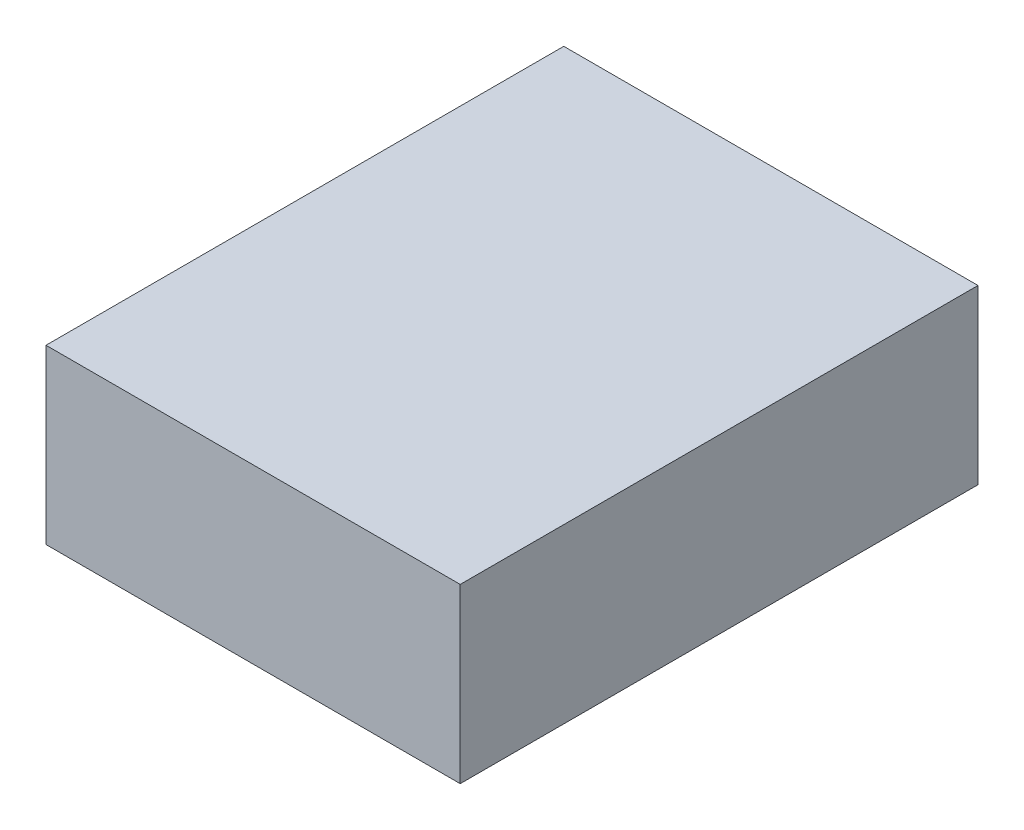
ISO-10303-21;
HEADER;
FILE_DESCRIPTION(('STEP AP214'),'2;1');
FILE_NAME('part.step','',(''),(''),'','','');
FILE_SCHEMA(('AUTOMOTIVE_DESIGN { 1 0 10303 214 1 1 1 1 }'));
ENDSEC;
DATA;
#1=APPLICATION_CONTEXT('core data for automotive mechanical design processes');
#2=APPLICATION_PROTOCOL_DEFINITION('international standard','automotive_design',2000,#1);
#3=PRODUCT_CONTEXT('',#1,'mechanical');
#4=PRODUCT('Part','Part','',(#3));
#5=PRODUCT_RELATED_PRODUCT_CATEGORY('part','',(#4));
#6=PRODUCT_DEFINITION_FORMATION('','',#4);
#7=PRODUCT_DEFINITION_CONTEXT('part definition',#1,'design');
#8=PRODUCT_DEFINITION('design','',#6,#7);
#9=PRODUCT_DEFINITION_SHAPE('','',#8);
#10=(LENGTH_UNIT() NAMED_UNIT(*) SI_UNIT(.MILLI.,.METRE.));
#11=(NAMED_UNIT(*) PLANE_ANGLE_UNIT() SI_UNIT($,.RADIAN.));
#12=(NAMED_UNIT(*) SI_UNIT($,.STERADIAN.) SOLID_ANGLE_UNIT());
#13=UNCERTAINTY_MEASURE_WITH_UNIT(LENGTH_MEASURE(1.E-05),#10,'distance_accuracy_value','');
#14=(GEOMETRIC_REPRESENTATION_CONTEXT(3) GLOBAL_UNCERTAINTY_ASSIGNED_CONTEXT((#13)) GLOBAL_UNIT_ASSIGNED_CONTEXT((#10,
#11,#12)) REPRESENTATION_CONTEXT('',''));
#15=CARTESIAN_POINT('',(0.,0.,0.));
#16=DIRECTION('',(0.,0.,1.));
#17=DIRECTION('',(1.,0.,0.));
#18=AXIS2_PLACEMENT_3D('',#15,#16,#17);
#19=CARTESIAN_POINT('',(0.,127.,0.));
#20=DIRECTION('',(1.,0.,0.));
#21=DIRECTION('',(0.,0.,-1.));
#22=AXIS2_PLACEMENT_3D('',#19,#20,#21);
#23=PLANE('',#22);
#24=DIRECTION('',(0.,0.,1.));
#25=VECTOR('',#24,1.);
#26=CARTESIAN_POINT('',(0.,0.,0.));
#27=LINE('',#26,#25);
#28=CARTESIAN_POINT('',(0.,0.,0.));
#29=VERTEX_POINT('',#28);
#30=CARTESIAN_POINT('',(0.,0.,381.));
#31=VERTEX_POINT('',#30);
#32=EDGE_CURVE('E113',#29,#31,#27,.T.);
#33=ORIENTED_EDGE('',*,*,#32,.T.);
#34=DIRECTION('',(0.,-1.,0.));
#35=VECTOR('',#34,1.);
#36=CARTESIAN_POINT('',(0.,127.,381.));
#37=LINE('',#36,#35);
#38=CARTESIAN_POINT('',(0.,127.,381.));
#39=VERTEX_POINT('',#38);
#40=EDGE_CURVE('E11',#39,#31,#37,.T.);
#41=ORIENTED_EDGE('',*,*,#40,.F.);
#42=DIRECTION('',(0.,0.,1.));
#43=VECTOR('',#42,1.);
#44=CARTESIAN_POINT('',(0.,127.,0.));
#45=LINE('',#44,#43);
#46=CARTESIAN_POINT('',(0.,127.,0.));
#47=VERTEX_POINT('',#46);
#48=EDGE_CURVE('E97',#47,#39,#45,.T.);
#49=ORIENTED_EDGE('',*,*,#48,.F.);
#50=DIRECTION('',(0.,-1.,0.));
#51=VECTOR('',#50,1.);
#52=CARTESIAN_POINT('',(0.,127.,0.));
#53=LINE('',#52,#51);
#54=EDGE_CURVE('E109',#47,#29,#53,.T.);
#55=ORIENTED_EDGE('',*,*,#54,.T.);
#56=EDGE_LOOP('',(#33,#41,#49,#55));
#57=FACE_BOUND('',#56,.T.);
#58=ADVANCED_FACE('F45',(#57),#23,.F.);
#59=CARTESIAN_POINT('',(0.,127.,381.));
#60=DIRECTION('',(0.,0.,-1.));
#61=DIRECTION('',(-1.,0.,0.));
#62=AXIS2_PLACEMENT_3D('',#59,#60,#61);
#63=PLANE('',#62);
#64=DIRECTION('',(1.,0.,0.));
#65=VECTOR('',#64,1.);
#66=CARTESIAN_POINT('',(0.,0.,381.));
#67=LINE('',#66,#65);
#68=CARTESIAN_POINT('',(304.8,0.,381.));
#69=VERTEX_POINT('',#68);
#70=EDGE_CURVE('E102',#31,#69,#67,.T.);
#71=ORIENTED_EDGE('',*,*,#70,.T.);
#72=DIRECTION('',(0.,-1.,0.));
#73=VECTOR('',#72,1.);
#74=CARTESIAN_POINT('',(304.8,127.,381.));
#75=LINE('',#74,#73);
#76=CARTESIAN_POINT('',(304.8,127.,381.));
#77=VERTEX_POINT('',#76);
#78=EDGE_CURVE('E54',#77,#69,#75,.T.);
#79=ORIENTED_EDGE('',*,*,#78,.F.);
#80=DIRECTION('',(1.,0.,0.));
#81=VECTOR('',#80,1.);
#82=CARTESIAN_POINT('',(0.,127.,381.));
#83=LINE('',#82,#81);
#84=EDGE_CURVE('E92',#39,#77,#83,.T.);
#85=ORIENTED_EDGE('',*,*,#84,.F.);
#86=ORIENTED_EDGE('',*,*,#40,.T.);
#87=EDGE_LOOP('',(#71,#79,#85,#86));
#88=FACE_BOUND('',#87,.T.);
#89=ADVANCED_FACE('F101',(#88),#63,.F.);
#90=CARTESIAN_POINT('',(304.8,127.,0.));
#91=DIRECTION('',(-1.,0.,0.));
#92=DIRECTION('',(0.,0.,1.));
#93=AXIS2_PLACEMENT_3D('',#90,#91,#92);
#94=PLANE('',#93);
#95=DIRECTION('',(0.,0.,-1.));
#96=VECTOR('',#95,1.);
#97=CARTESIAN_POINT('',(304.8,0.,0.));
#98=LINE('',#97,#96);
#99=CARTESIAN_POINT('',(304.8,0.,0.));
#100=VERTEX_POINT('',#99);
#101=EDGE_CURVE('E79',#69,#100,#98,.T.);
#102=ORIENTED_EDGE('',*,*,#101,.T.);
#103=DIRECTION('',(0.,-1.,0.));
#104=VECTOR('',#103,1.);
#105=CARTESIAN_POINT('',(304.8,127.,0.));
#106=LINE('',#105,#104);
#107=CARTESIAN_POINT('',(304.8,127.,0.));
#108=VERTEX_POINT('',#107);
#109=EDGE_CURVE('E104',#108,#100,#106,.T.);
#110=ORIENTED_EDGE('',*,*,#109,.F.);
#111=DIRECTION('',(0.,0.,-1.));
#112=VECTOR('',#111,1.);
#113=CARTESIAN_POINT('',(304.8,127.,0.));
#114=LINE('',#113,#112);
#115=EDGE_CURVE('E95',#77,#108,#114,.T.);
#116=ORIENTED_EDGE('',*,*,#115,.F.);
#117=ORIENTED_EDGE('',*,*,#78,.T.);
#118=EDGE_LOOP('',(#102,#110,#116,#117));
#119=FACE_BOUND('',#118,.T.);
#120=ADVANCED_FACE('F105',(#119),#94,.F.);
#121=CARTESIAN_POINT('',(0.,127.,0.));
#122=DIRECTION('',(0.,0.,1.));
#123=DIRECTION('',(1.,0.,0.));
#124=AXIS2_PLACEMENT_3D('',#121,#122,#123);
#125=PLANE('',#124);
#126=DIRECTION('',(-1.,0.,0.));
#127=VECTOR('',#126,1.);
#128=CARTESIAN_POINT('',(0.,0.,0.));
#129=LINE('',#128,#127);
#130=EDGE_CURVE('E85',#100,#29,#129,.T.);
#131=ORIENTED_EDGE('',*,*,#130,.T.);
#132=ORIENTED_EDGE('',*,*,#54,.F.);
#133=DIRECTION('',(-1.,0.,0.));
#134=VECTOR('',#133,1.);
#135=CARTESIAN_POINT('',(0.,127.,0.));
#136=LINE('',#135,#134);
#137=EDGE_CURVE('E62',#108,#47,#136,.T.);
#138=ORIENTED_EDGE('',*,*,#137,.F.);
#139=ORIENTED_EDGE('',*,*,#109,.T.);
#140=EDGE_LOOP('',(#131,#132,#138,#139));
#141=FACE_BOUND('',#140,.T.);
#142=ADVANCED_FACE('F126',(#141),#125,.F.);
#143=CARTESIAN_POINT('',(0.,127.,0.));
#144=DIRECTION('',(0.,1.,0.));
#145=DIRECTION('',(0.,0.,1.));
#146=AXIS2_PLACEMENT_3D('',#143,#144,#145);
#147=PLANE('',#146);
#148=ORIENTED_EDGE('',*,*,#48,.T.);
#149=ORIENTED_EDGE('',*,*,#84,.T.);
#150=ORIENTED_EDGE('',*,*,#115,.T.);
#151=ORIENTED_EDGE('',*,*,#137,.T.);
#152=EDGE_LOOP('',(#148,#149,#150,#151));
#153=FACE_BOUND('',#152,.T.);
#154=ADVANCED_FACE('F93',(#153),#147,.T.);
#155=CARTESIAN_POINT('',(0.,0.,0.));
#156=DIRECTION('',(0.,1.,0.));
#157=DIRECTION('',(0.,0.,1.));
#158=AXIS2_PLACEMENT_3D('',#155,#156,#157);
#159=PLANE('',#158);
#160=ORIENTED_EDGE('',*,*,#32,.F.);
#161=ORIENTED_EDGE('',*,*,#130,.F.);
#162=ORIENTED_EDGE('',*,*,#101,.F.);
#163=ORIENTED_EDGE('',*,*,#70,.F.);
#164=EDGE_LOOP('',(#160,#161,#162,#163));
#165=FACE_BOUND('',#164,.T.);
#166=ADVANCED_FACE('F129',(#165),#159,.F.);
#167=CLOSED_SHELL('',(#58,#89,#120,#142,#154,#166));
#168=MANIFOLD_SOLID_BREP('B2',#167);
#169=ADVANCED_BREP_SHAPE_REPRESENTATION('',(#18,#168),#14);
#170=SHAPE_DEFINITION_REPRESENTATION(#9,#169);
ENDSEC;
END-ISO-10303-21;
